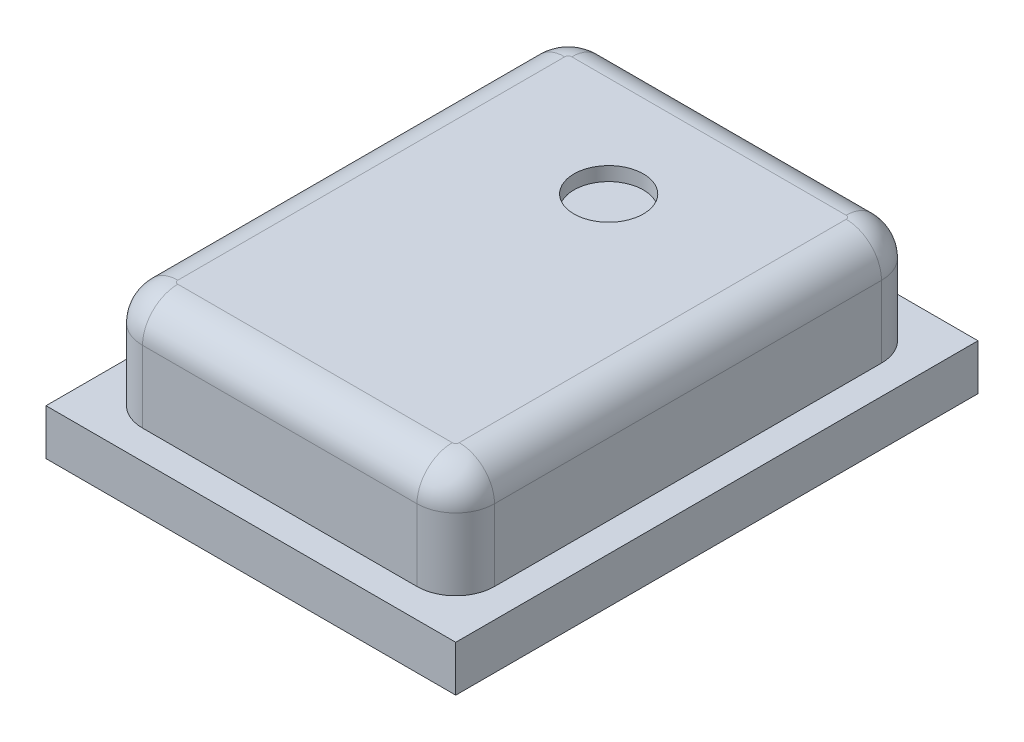
ISO-10303-21;
HEADER;
FILE_DESCRIPTION(('STEP AP214'),'2;1');
FILE_NAME('part.step','',(''),(''),'','','');
FILE_SCHEMA(('AUTOMOTIVE_DESIGN { 1 0 10303 214 1 1 1 1 }'));
ENDSEC;
DATA;
#1=APPLICATION_CONTEXT('core data for automotive mechanical design processes');
#2=APPLICATION_PROTOCOL_DEFINITION('international standard','automotive_design',2000,#1);
#3=PRODUCT_CONTEXT('',#1,'mechanical');
#4=PRODUCT('Part','Part','',(#3));
#5=PRODUCT_RELATED_PRODUCT_CATEGORY('part','',(#4));
#6=PRODUCT_DEFINITION_FORMATION('','',#4);
#7=PRODUCT_DEFINITION_CONTEXT('part definition',#1,'design');
#8=PRODUCT_DEFINITION('design','',#6,#7);
#9=PRODUCT_DEFINITION_SHAPE('','',#8);
#10=(LENGTH_UNIT() NAMED_UNIT(*) SI_UNIT(.MILLI.,.METRE.));
#11=(NAMED_UNIT(*) PLANE_ANGLE_UNIT() SI_UNIT($,.RADIAN.));
#12=(NAMED_UNIT(*) SI_UNIT($,.STERADIAN.) SOLID_ANGLE_UNIT());
#13=UNCERTAINTY_MEASURE_WITH_UNIT(LENGTH_MEASURE(1.E-05),#10,'distance_accuracy_value','');
#14=(GEOMETRIC_REPRESENTATION_CONTEXT(3) GLOBAL_UNCERTAINTY_ASSIGNED_CONTEXT((#13)) GLOBAL_UNIT_ASSIGNED_CONTEXT((#10,
#11,#12)) REPRESENTATION_CONTEXT('',''));
#15=CARTESIAN_POINT('',(0.,0.,0.));
#16=DIRECTION('',(0.,0.,1.));
#17=DIRECTION('',(1.,0.,0.));
#18=AXIS2_PLACEMENT_3D('',#15,#16,#17);
#19=CARTESIAN_POINT('',(0.,1.1,0.));
#20=DIRECTION('',(0.,-1.,0.));
#21=DIRECTION('',(0.,0.,-1.));
#22=AXIS2_PLACEMENT_3D('',#19,#20,#21);
#23=PLANE('',#22);
#24=CARTESIAN_POINT('',(0.,1.1,-0.696));
#25=DIRECTION('',(0.,1.,0.));
#26=DIRECTION('',(0.,0.,1.));
#27=AXIS2_PLACEMENT_3D('',#24,#25,#26);
#28=CIRCLE('',#27,0.25);
#29=CARTESIAN_POINT('',(0.,1.1,-0.446));
#30=VERTEX_POINT('',#29);
#31=EDGE_CURVE('E316',#30,#30,#28,.T.);
#32=ORIENTED_EDGE('',*,*,#31,.F.);
#33=EDGE_LOOP('',(#32));
#34=FACE_BOUND('',#33,.T.);
#35=CARTESIAN_POINT('',(-0.988,1.1,1.393));
#36=DIRECTION('',(0.,-1.,0.));
#37=DIRECTION('',(0.,0.,-1.));
#38=AXIS2_PLACEMENT_3D('',#35,#36,#37);
#39=CIRCLE('',#38,0.025);
#40=CARTESIAN_POINT('',(-0.988,1.1,1.418));
#41=VERTEX_POINT('',#40);
#42=CARTESIAN_POINT('',(-1.013,1.1,1.393));
#43=VERTEX_POINT('',#42);
#44=EDGE_CURVE('E240',#41,#43,#39,.T.);
#45=ORIENTED_EDGE('',*,*,#44,.F.);
#46=DIRECTION('',(1.,0.,0.));
#47=VECTOR('',#46,1.);
#48=CARTESIAN_POINT('',(0.,1.1,1.418));
#49=LINE('',#48,#47);
#50=CARTESIAN_POINT('',(0.988,1.1,1.418));
#51=VERTEX_POINT('',#50);
#52=EDGE_CURVE('E203',#41,#51,#49,.T.);
#53=ORIENTED_EDGE('',*,*,#52,.T.);
#54=CARTESIAN_POINT('',(0.988,1.1,1.393));
#55=DIRECTION('',(0.,-1.,0.));
#56=DIRECTION('',(0.,0.,-1.));
#57=AXIS2_PLACEMENT_3D('',#54,#55,#56);
#58=CIRCLE('',#57,0.025);
#59=CARTESIAN_POINT('',(1.013,1.1,1.393));
#60=VERTEX_POINT('',#59);
#61=EDGE_CURVE('E236',#60,#51,#58,.T.);
#62=ORIENTED_EDGE('',*,*,#61,.F.);
#63=DIRECTION('',(0.,0.,-1.));
#64=VECTOR('',#63,1.);
#65=CARTESIAN_POINT('',(1.013,1.1,0.));
#66=LINE('',#65,#64);
#67=CARTESIAN_POINT('',(1.013,1.1,-1.393));
#68=VERTEX_POINT('',#67);
#69=EDGE_CURVE('E185',#60,#68,#66,.T.);
#70=ORIENTED_EDGE('',*,*,#69,.T.);
#71=CARTESIAN_POINT('',(0.988,1.1,-1.393));
#72=DIRECTION('',(0.,-1.,0.));
#73=DIRECTION('',(0.,0.,-1.));
#74=AXIS2_PLACEMENT_3D('',#71,#72,#73);
#75=CIRCLE('',#74,0.025);
#76=CARTESIAN_POINT('',(0.988,1.1,-1.418));
#77=VERTEX_POINT('',#76);
#78=EDGE_CURVE('E229',#77,#68,#75,.T.);
#79=ORIENTED_EDGE('',*,*,#78,.F.);
#80=DIRECTION('',(-1.,0.,0.));
#81=VECTOR('',#80,1.);
#82=CARTESIAN_POINT('',(0.,1.1,-1.418));
#83=LINE('',#82,#81);
#84=CARTESIAN_POINT('',(-0.988,1.1,-1.418));
#85=VERTEX_POINT('',#84);
#86=EDGE_CURVE('E190',#77,#85,#83,.T.);
#87=ORIENTED_EDGE('',*,*,#86,.T.);
#88=CARTESIAN_POINT('',(-0.988,1.1,-1.393));
#89=DIRECTION('',(0.,-1.,0.));
#90=DIRECTION('',(0.,0.,-1.));
#91=AXIS2_PLACEMENT_3D('',#88,#89,#90);
#92=CIRCLE('',#91,0.025);
#93=CARTESIAN_POINT('',(-1.013,1.1,-1.393));
#94=VERTEX_POINT('',#93);
#95=EDGE_CURVE('E233',#94,#85,#92,.T.);
#96=ORIENTED_EDGE('',*,*,#95,.F.);
#97=DIRECTION('',(0.,0.,1.));
#98=VECTOR('',#97,1.);
#99=CARTESIAN_POINT('',(-1.013,1.1,0.));
#100=LINE('',#99,#98);
#101=EDGE_CURVE('E199',#94,#43,#100,.T.);
#102=ORIENTED_EDGE('',*,*,#101,.T.);
#103=EDGE_LOOP('',(#45,#53,#62,#70,#79,#87,#96,#102));
#104=FACE_BOUND('',#103,.T.);
#105=ADVANCED_FACE('F41',(#34,#104),#23,.F.);
#106=CARTESIAN_POINT('',(1.475,0.33,-1.88));
#107=DIRECTION('',(-1.,0.,0.));
#108=DIRECTION('',(0.,0.,1.));
#109=AXIS2_PLACEMENT_3D('',#106,#107,#108);
#110=PLANE('',#109);
#111=DIRECTION('',(0.,0.,-1.));
#112=VECTOR('',#111,1.);
#113=CARTESIAN_POINT('',(1.475,0.,-1.88));
#114=LINE('',#113,#112);
#115=CARTESIAN_POINT('',(1.475,0.,1.88));
#116=VERTEX_POINT('',#115);
#117=CARTESIAN_POINT('',(1.475,0.,-1.88));
#118=VERTEX_POINT('',#117);
#119=EDGE_CURVE('E183',#116,#118,#114,.T.);
#120=ORIENTED_EDGE('',*,*,#119,.T.);
#121=DIRECTION('',(0.,-1.,0.));
#122=VECTOR('',#121,1.);
#123=CARTESIAN_POINT('',(1.475,0.33,-1.88));
#124=LINE('',#123,#122);
#125=CARTESIAN_POINT('',(1.475,0.33,-1.88));
#126=VERTEX_POINT('',#125);
#127=EDGE_CURVE('E161',#126,#118,#124,.T.);
#128=ORIENTED_EDGE('',*,*,#127,.F.);
#129=DIRECTION('',(0.,0.,-1.));
#130=VECTOR('',#129,1.);
#131=CARTESIAN_POINT('',(1.475,0.33,-1.88));
#132=LINE('',#131,#130);
#133=CARTESIAN_POINT('',(1.475,0.33,1.88));
#134=VERTEX_POINT('',#133);
#135=EDGE_CURVE('E169',#134,#126,#132,.T.);
#136=ORIENTED_EDGE('',*,*,#135,.F.);
#137=DIRECTION('',(0.,-1.,0.));
#138=VECTOR('',#137,1.);
#139=CARTESIAN_POINT('',(1.475,0.33,1.88));
#140=LINE('',#139,#138);
#141=EDGE_CURVE('E342',#134,#116,#140,.T.);
#142=ORIENTED_EDGE('',*,*,#141,.T.);
#143=EDGE_LOOP('',(#120,#128,#136,#142));
#144=FACE_BOUND('',#143,.T.);
#145=ADVANCED_FACE('F181',(#144),#110,.F.);
#146=CARTESIAN_POINT('',(-1.475,0.33,-1.88));
#147=DIRECTION('',(0.,0.,1.));
#148=DIRECTION('',(1.,0.,0.));
#149=AXIS2_PLACEMENT_3D('',#146,#147,#148);
#150=PLANE('',#149);
#151=DIRECTION('',(-1.,0.,0.));
#152=VECTOR('',#151,1.);
#153=CARTESIAN_POINT('',(-1.475,0.,-1.88));
#154=LINE('',#153,#152);
#155=CARTESIAN_POINT('',(-1.475,0.,-1.88));
#156=VERTEX_POINT('',#155);
#157=EDGE_CURVE('E345',#118,#156,#154,.T.);
#158=ORIENTED_EDGE('',*,*,#157,.T.);
#159=DIRECTION('',(0.,-1.,0.));
#160=VECTOR('',#159,1.);
#161=CARTESIAN_POINT('',(-1.475,0.33,-1.88));
#162=LINE('',#161,#160);
#163=CARTESIAN_POINT('',(-1.475,0.33,-1.88));
#164=VERTEX_POINT('',#163);
#165=EDGE_CURVE('E164',#164,#156,#162,.T.);
#166=ORIENTED_EDGE('',*,*,#165,.F.);
#167=DIRECTION('',(-1.,0.,0.));
#168=VECTOR('',#167,1.);
#169=CARTESIAN_POINT('',(-1.475,0.33,-1.88));
#170=LINE('',#169,#168);
#171=EDGE_CURVE('E157',#126,#164,#170,.T.);
#172=ORIENTED_EDGE('',*,*,#171,.F.);
#173=ORIENTED_EDGE('',*,*,#127,.T.);
#174=EDGE_LOOP('',(#158,#166,#172,#173));
#175=FACE_BOUND('',#174,.T.);
#176=ADVANCED_FACE('F159',(#175),#150,.F.);
#177=CARTESIAN_POINT('',(-1.475,0.33,-1.88));
#178=DIRECTION('',(1.,0.,0.));
#179=DIRECTION('',(0.,0.,-1.));
#180=AXIS2_PLACEMENT_3D('',#177,#178,#179);
#181=PLANE('',#180);
#182=DIRECTION('',(0.,0.,1.));
#183=VECTOR('',#182,1.);
#184=CARTESIAN_POINT('',(-1.475,0.,-1.88));
#185=LINE('',#184,#183);
#186=CARTESIAN_POINT('',(-1.475,0.,1.88));
#187=VERTEX_POINT('',#186);
#188=EDGE_CURVE('E348',#156,#187,#185,.T.);
#189=ORIENTED_EDGE('',*,*,#188,.T.);
#190=DIRECTION('',(0.,-1.,0.));
#191=VECTOR('',#190,1.);
#192=CARTESIAN_POINT('',(-1.475,0.33,1.88));
#193=LINE('',#192,#191);
#194=CARTESIAN_POINT('',(-1.475,0.33,1.88));
#195=VERTEX_POINT('',#194);
#196=EDGE_CURVE('E192',#195,#187,#193,.T.);
#197=ORIENTED_EDGE('',*,*,#196,.F.);
#198=DIRECTION('',(0.,0.,1.));
#199=VECTOR('',#198,1.);
#200=CARTESIAN_POINT('',(-1.475,0.33,-1.88));
#201=LINE('',#200,#199);
#202=EDGE_CURVE('E168',#164,#195,#201,.T.);
#203=ORIENTED_EDGE('',*,*,#202,.F.);
#204=ORIENTED_EDGE('',*,*,#165,.T.);
#205=EDGE_LOOP('',(#189,#197,#203,#204));
#206=FACE_BOUND('',#205,.T.);
#207=ADVANCED_FACE('F364',(#206),#181,.F.);
#208=CARTESIAN_POINT('',(-1.475,0.33,1.88));
#209=DIRECTION('',(0.,0.,-1.));
#210=DIRECTION('',(-1.,0.,0.));
#211=AXIS2_PLACEMENT_3D('',#208,#209,#210);
#212=PLANE('',#211);
#213=DIRECTION('',(1.,0.,0.));
#214=VECTOR('',#213,1.);
#215=CARTESIAN_POINT('',(-1.475,0.,1.88));
#216=LINE('',#215,#214);
#217=EDGE_CURVE('E179',#187,#116,#216,.T.);
#218=ORIENTED_EDGE('',*,*,#217,.T.);
#219=ORIENTED_EDGE('',*,*,#141,.F.);
#220=DIRECTION('',(1.,0.,0.));
#221=VECTOR('',#220,1.);
#222=CARTESIAN_POINT('',(-1.475,0.33,1.88));
#223=LINE('',#222,#221);
#224=EDGE_CURVE('E174',#195,#134,#223,.T.);
#225=ORIENTED_EDGE('',*,*,#224,.F.);
#226=ORIENTED_EDGE('',*,*,#196,.T.);
#227=EDGE_LOOP('',(#218,#219,#225,#226));
#228=FACE_BOUND('',#227,.T.);
#229=ADVANCED_FACE('F359',(#228),#212,.F.);
#230=CARTESIAN_POINT('',(0.,0.33,0.));
#231=DIRECTION('',(0.,1.,0.));
#232=DIRECTION('',(0.,0.,1.));
#233=AXIS2_PLACEMENT_3D('',#230,#231,#232);
#234=PLANE('',#233);
#235=DIRECTION('',(0.,0.,-1.));
#236=VECTOR('',#235,1.);
#237=CARTESIAN_POINT('',(1.267,0.33,1.672));
#238=LINE('',#237,#236);
#239=CARTESIAN_POINT('',(1.267,0.33,1.393));
#240=VERTEX_POINT('',#239);
#241=CARTESIAN_POINT('',(1.267,0.33,-1.393));
#242=VERTEX_POINT('',#241);
#243=EDGE_CURVE('E297',#240,#242,#238,.T.);
#244=ORIENTED_EDGE('',*,*,#243,.F.);
#245=CARTESIAN_POINT('',(0.988,0.33,1.393));
#246=DIRECTION('',(0.,1.,0.));
#247=DIRECTION('',(0.,0.,1.));
#248=AXIS2_PLACEMENT_3D('',#245,#246,#247);
#249=CIRCLE('',#248,0.279);
#250=CARTESIAN_POINT('',(0.988,0.33,1.672));
#251=VERTEX_POINT('',#250);
#252=EDGE_CURVE('E51',#240,#251,#249,.F.);
#253=ORIENTED_EDGE('',*,*,#252,.T.);
#254=DIRECTION('',(1.,0.,0.));
#255=VECTOR('',#254,1.);
#256=CARTESIAN_POINT('',(-1.267,0.33,1.672));
#257=LINE('',#256,#255);
#258=CARTESIAN_POINT('',(-0.988,0.33,1.672));
#259=VERTEX_POINT('',#258);
#260=EDGE_CURVE('E335',#259,#251,#257,.T.);
#261=ORIENTED_EDGE('',*,*,#260,.F.);
#262=CARTESIAN_POINT('',(-0.988,0.33,1.393));
#263=DIRECTION('',(0.,1.,0.));
#264=DIRECTION('',(0.,0.,1.));
#265=AXIS2_PLACEMENT_3D('',#262,#263,#264);
#266=CIRCLE('',#265,0.279);
#267=CARTESIAN_POINT('',(-1.267,0.33,1.393));
#268=VERTEX_POINT('',#267);
#269=EDGE_CURVE('E11',#259,#268,#266,.F.);
#270=ORIENTED_EDGE('',*,*,#269,.T.);
#271=DIRECTION('',(0.,0.,1.));
#272=VECTOR('',#271,1.);
#273=CARTESIAN_POINT('',(-1.267,0.33,1.672));
#274=LINE('',#273,#272);
#275=CARTESIAN_POINT('',(-1.267,0.33,-1.393));
#276=VERTEX_POINT('',#275);
#277=EDGE_CURVE('E331',#276,#268,#274,.T.);
#278=ORIENTED_EDGE('',*,*,#277,.F.);
#279=CARTESIAN_POINT('',(-0.988,0.33,-1.393));
#280=DIRECTION('',(0.,1.,0.));
#281=DIRECTION('',(0.,0.,1.));
#282=AXIS2_PLACEMENT_3D('',#279,#280,#281);
#283=CIRCLE('',#282,0.279);
#284=CARTESIAN_POINT('',(-0.988,0.33,-1.672));
#285=VERTEX_POINT('',#284);
#286=EDGE_CURVE('E288',#276,#285,#283,.F.);
#287=ORIENTED_EDGE('',*,*,#286,.T.);
#288=DIRECTION('',(-1.,0.,0.));
#289=VECTOR('',#288,1.);
#290=CARTESIAN_POINT('',(-1.267,0.33,-1.672));
#291=LINE('',#290,#289);
#292=CARTESIAN_POINT('',(0.988,0.33,-1.672));
#293=VERTEX_POINT('',#292);
#294=EDGE_CURVE('E327',#293,#285,#291,.T.);
#295=ORIENTED_EDGE('',*,*,#294,.F.);
#296=CARTESIAN_POINT('',(0.988,0.33,-1.393));
#297=DIRECTION('',(0.,1.,0.));
#298=DIRECTION('',(0.,0.,1.));
#299=AXIS2_PLACEMENT_3D('',#296,#297,#298);
#300=CIRCLE('',#299,0.279);
#301=EDGE_CURVE('E285',#293,#242,#300,.F.);
#302=ORIENTED_EDGE('',*,*,#301,.T.);
#303=EDGE_LOOP('',(#244,#253,#261,#270,#278,#287,#295,#302));
#304=FACE_BOUND('',#303,.T.);
#305=ORIENTED_EDGE('',*,*,#135,.T.);
#306=ORIENTED_EDGE('',*,*,#171,.T.);
#307=ORIENTED_EDGE('',*,*,#202,.T.);
#308=ORIENTED_EDGE('',*,*,#224,.T.);
#309=EDGE_LOOP('',(#305,#306,#307,#308));
#310=FACE_BOUND('',#309,.T.);
#311=ADVANCED_FACE('F172',(#304,#310),#234,.T.);
#312=CARTESIAN_POINT('',(0.,0.,0.));
#313=DIRECTION('',(0.,1.,0.));
#314=DIRECTION('',(0.,0.,1.));
#315=AXIS2_PLACEMENT_3D('',#312,#313,#314);
#316=PLANE('',#315);
#317=ORIENTED_EDGE('',*,*,#119,.F.);
#318=ORIENTED_EDGE('',*,*,#217,.F.);
#319=ORIENTED_EDGE('',*,*,#188,.F.);
#320=ORIENTED_EDGE('',*,*,#157,.F.);
#321=EDGE_LOOP('',(#317,#318,#319,#320));
#322=FACE_BOUND('',#321,.T.);
#323=ADVANCED_FACE('F363',(#322),#316,.F.);
#324=CARTESIAN_POINT('',(1.267,1.1,1.672));
#325=DIRECTION('',(-1.,0.,0.));
#326=DIRECTION('',(0.,0.,1.));
#327=AXIS2_PLACEMENT_3D('',#324,#325,#326);
#328=PLANE('',#327);
#329=ORIENTED_EDGE('',*,*,#243,.T.);
#330=DIRECTION('',(0.,-1.,0.));
#331=VECTOR('',#330,1.);
#332=CARTESIAN_POINT('',(1.267,1.1,-1.393));
#333=LINE('',#332,#331);
#334=CARTESIAN_POINT('',(1.267,0.846,-1.393));
#335=VERTEX_POINT('',#334);
#336=EDGE_CURVE('E271',#242,#335,#333,.F.);
#337=ORIENTED_EDGE('',*,*,#336,.T.);
#338=DIRECTION('',(0.,0.,-1.));
#339=VECTOR('',#338,1.);
#340=CARTESIAN_POINT('',(1.267,0.846,1.672));
#341=LINE('',#340,#339);
#342=CARTESIAN_POINT('',(1.267,0.846,1.393));
#343=VERTEX_POINT('',#342);
#344=EDGE_CURVE('E218',#335,#343,#341,.F.);
#345=ORIENTED_EDGE('',*,*,#344,.T.);
#346=DIRECTION('',(0.,-1.,0.));
#347=VECTOR('',#346,1.);
#348=CARTESIAN_POINT('',(1.267,1.1,1.393));
#349=LINE('',#348,#347);
#350=EDGE_CURVE('E268',#343,#240,#349,.T.);
#351=ORIENTED_EDGE('',*,*,#350,.T.);
#352=EDGE_LOOP('',(#329,#337,#345,#351));
#353=FACE_BOUND('',#352,.T.);
#354=ADVANCED_FACE('F397',(#353),#328,.F.);
#355=CARTESIAN_POINT('',(-1.267,1.1,-1.672));
#356=DIRECTION('',(0.,0.,1.));
#357=DIRECTION('',(1.,0.,0.));
#358=AXIS2_PLACEMENT_3D('',#355,#356,#357);
#359=PLANE('',#358);
#360=DIRECTION('',(-1.,0.,0.));
#361=VECTOR('',#360,1.);
#362=CARTESIAN_POINT('',(-1.267,0.846,-1.672));
#363=LINE('',#362,#361);
#364=CARTESIAN_POINT('',(-0.988,0.846,-1.672));
#365=VERTEX_POINT('',#364);
#366=CARTESIAN_POINT('',(0.988,0.846,-1.672));
#367=VERTEX_POINT('',#366);
#368=EDGE_CURVE('E214',#365,#367,#363,.F.);
#369=ORIENTED_EDGE('',*,*,#368,.T.);
#370=DIRECTION('',(0.,-1.,0.));
#371=VECTOR('',#370,1.);
#372=CARTESIAN_POINT('',(0.988,1.1,-1.672));
#373=LINE('',#372,#371);
#374=EDGE_CURVE('E265',#367,#293,#373,.T.);
#375=ORIENTED_EDGE('',*,*,#374,.T.);
#376=ORIENTED_EDGE('',*,*,#294,.T.);
#377=DIRECTION('',(0.,-1.,0.));
#378=VECTOR('',#377,1.);
#379=CARTESIAN_POINT('',(-0.988,1.1,-1.672));
#380=LINE('',#379,#378);
#381=EDGE_CURVE('E262',#285,#365,#380,.F.);
#382=ORIENTED_EDGE('',*,*,#381,.T.);
#383=EDGE_LOOP('',(#369,#375,#376,#382));
#384=FACE_BOUND('',#383,.T.);
#385=ADVANCED_FACE('F393',(#384),#359,.F.);
#386=CARTESIAN_POINT('',(-1.267,1.1,1.672));
#387=DIRECTION('',(1.,0.,0.));
#388=DIRECTION('',(0.,0.,-1.));
#389=AXIS2_PLACEMENT_3D('',#386,#387,#388);
#390=PLANE('',#389);
#391=DIRECTION('',(0.,0.,1.));
#392=VECTOR('',#391,1.);
#393=CARTESIAN_POINT('',(-1.267,0.846,1.672));
#394=LINE('',#393,#392);
#395=CARTESIAN_POINT('',(-1.267,0.846,1.393));
#396=VERTEX_POINT('',#395);
#397=CARTESIAN_POINT('',(-1.267,0.846,-1.393));
#398=VERTEX_POINT('',#397);
#399=EDGE_CURVE('E210',#396,#398,#394,.F.);
#400=ORIENTED_EDGE('',*,*,#399,.T.);
#401=DIRECTION('',(0.,-1.,0.));
#402=VECTOR('',#401,1.);
#403=CARTESIAN_POINT('',(-1.267,1.1,-1.393));
#404=LINE('',#403,#402);
#405=EDGE_CURVE('E277',#398,#276,#404,.T.);
#406=ORIENTED_EDGE('',*,*,#405,.T.);
#407=ORIENTED_EDGE('',*,*,#277,.T.);
#408=DIRECTION('',(0.,-1.,0.));
#409=VECTOR('',#408,1.);
#410=CARTESIAN_POINT('',(-1.267,1.1,1.393));
#411=LINE('',#410,#409);
#412=EDGE_CURVE('E274',#268,#396,#411,.F.);
#413=ORIENTED_EDGE('',*,*,#412,.T.);
#414=EDGE_LOOP('',(#400,#406,#407,#413));
#415=FACE_BOUND('',#414,.T.);
#416=ADVANCED_FACE('F390',(#415),#390,.F.);
#417=CARTESIAN_POINT('',(-1.267,1.1,1.672));
#418=DIRECTION('',(0.,0.,-1.));
#419=DIRECTION('',(-1.,0.,0.));
#420=AXIS2_PLACEMENT_3D('',#417,#418,#419);
#421=PLANE('',#420);
#422=ORIENTED_EDGE('',*,*,#260,.T.);
#423=DIRECTION('',(0.,-1.,0.));
#424=VECTOR('',#423,1.);
#425=CARTESIAN_POINT('',(0.988,1.1,1.672));
#426=LINE('',#425,#424);
#427=CARTESIAN_POINT('',(0.988,0.846,1.672));
#428=VERTEX_POINT('',#427);
#429=EDGE_CURVE('E282',#251,#428,#426,.F.);
#430=ORIENTED_EDGE('',*,*,#429,.T.);
#431=DIRECTION('',(1.,0.,0.));
#432=VECTOR('',#431,1.);
#433=CARTESIAN_POINT('',(-1.267,0.846,1.672));
#434=LINE('',#433,#432);
#435=CARTESIAN_POINT('',(-0.988,0.846,1.672));
#436=VERTEX_POINT('',#435);
#437=EDGE_CURVE('E207',#428,#436,#434,.F.);
#438=ORIENTED_EDGE('',*,*,#437,.T.);
#439=DIRECTION('',(0.,-1.,0.));
#440=VECTOR('',#439,1.);
#441=CARTESIAN_POINT('',(-0.988,1.1,1.672));
#442=LINE('',#441,#440);
#443=EDGE_CURVE('E65',#436,#259,#442,.T.);
#444=ORIENTED_EDGE('',*,*,#443,.T.);
#445=EDGE_LOOP('',(#422,#430,#438,#444));
#446=FACE_BOUND('',#445,.T.);
#447=ADVANCED_FACE('F386',(#446),#421,.F.);
#448=CARTESIAN_POINT('',(0.,0.846,-1.418));
#449=DIRECTION('',(-1.,0.,0.));
#450=DIRECTION('',(0.,0.,1.));
#451=AXIS2_PLACEMENT_3D('',#448,#449,#450);
#452=CYLINDRICAL_SURFACE('',#451,0.254);
#453=ORIENTED_EDGE('',*,*,#368,.F.);
#454=CARTESIAN_POINT('',(-0.988,0.846,-1.418));
#455=DIRECTION('',(1.,0.,0.));
#456=DIRECTION('',(0.,0.,-1.));
#457=AXIS2_PLACEMENT_3D('',#454,#455,#456);
#458=CIRCLE('',#457,0.254);
#459=EDGE_CURVE('E252',#365,#85,#458,.T.);
#460=ORIENTED_EDGE('',*,*,#459,.T.);
#461=ORIENTED_EDGE('',*,*,#86,.F.);
#462=CARTESIAN_POINT('',(0.988,0.846,-1.418));
#463=DIRECTION('',(-1.,0.,0.));
#464=DIRECTION('',(0.,0.,1.));
#465=AXIS2_PLACEMENT_3D('',#462,#463,#464);
#466=CIRCLE('',#465,0.254);
#467=EDGE_CURVE('E249',#77,#367,#466,.T.);
#468=ORIENTED_EDGE('',*,*,#467,.T.);
#469=EDGE_LOOP('',(#453,#460,#461,#468));
#470=FACE_BOUND('',#469,.T.);
#471=ADVANCED_FACE('F389',(#470),#452,.T.);
#472=CARTESIAN_POINT('',(-1.013,0.846,0.));
#473=DIRECTION('',(0.,0.,1.));
#474=DIRECTION('',(1.,0.,0.));
#475=AXIS2_PLACEMENT_3D('',#472,#473,#474);
#476=CYLINDRICAL_SURFACE('',#475,0.254);
#477=ORIENTED_EDGE('',*,*,#399,.F.);
#478=CARTESIAN_POINT('',(-1.013,0.846,1.393));
#479=DIRECTION('',(0.,0.,-1.));
#480=DIRECTION('',(-1.,0.,0.));
#481=AXIS2_PLACEMENT_3D('',#478,#479,#480);
#482=CIRCLE('',#481,0.254);
#483=EDGE_CURVE('E225',#396,#43,#482,.T.);
#484=ORIENTED_EDGE('',*,*,#483,.T.);
#485=ORIENTED_EDGE('',*,*,#101,.F.);
#486=CARTESIAN_POINT('',(-1.013,0.846,-1.393));
#487=DIRECTION('',(0.,0.,1.));
#488=DIRECTION('',(1.,0.,0.));
#489=AXIS2_PLACEMENT_3D('',#486,#487,#488);
#490=CIRCLE('',#489,0.254);
#491=EDGE_CURVE('E222',#94,#398,#490,.T.);
#492=ORIENTED_EDGE('',*,*,#491,.T.);
#493=EDGE_LOOP('',(#477,#484,#485,#492));
#494=FACE_BOUND('',#493,.T.);
#495=ADVANCED_FACE('F432',(#494),#476,.T.);
#496=CARTESIAN_POINT('',(1.013,0.846,0.));
#497=DIRECTION('',(0.,0.,-1.));
#498=DIRECTION('',(-1.,0.,0.));
#499=AXIS2_PLACEMENT_3D('',#496,#497,#498);
#500=CYLINDRICAL_SURFACE('',#499,0.254);
#501=ORIENTED_EDGE('',*,*,#344,.F.);
#502=CARTESIAN_POINT('',(1.013,0.846,-1.393));
#503=DIRECTION('',(0.,0.,1.));
#504=DIRECTION('',(1.,0.,0.));
#505=AXIS2_PLACEMENT_3D('',#502,#503,#504);
#506=CIRCLE('',#505,0.254);
#507=EDGE_CURVE('E259',#335,#68,#506,.T.);
#508=ORIENTED_EDGE('',*,*,#507,.T.);
#509=ORIENTED_EDGE('',*,*,#69,.F.);
#510=CARTESIAN_POINT('',(1.013,0.846,1.393));
#511=DIRECTION('',(0.,0.,-1.));
#512=DIRECTION('',(-1.,0.,0.));
#513=AXIS2_PLACEMENT_3D('',#510,#511,#512);
#514=CIRCLE('',#513,0.254);
#515=EDGE_CURVE('E256',#60,#343,#514,.T.);
#516=ORIENTED_EDGE('',*,*,#515,.T.);
#517=EDGE_LOOP('',(#501,#508,#509,#516));
#518=FACE_BOUND('',#517,.T.);
#519=ADVANCED_FACE('F440',(#518),#500,.T.);
#520=CARTESIAN_POINT('',(0.,0.846,1.418));
#521=DIRECTION('',(1.,0.,0.));
#522=DIRECTION('',(0.,0.,-1.));
#523=AXIS2_PLACEMENT_3D('',#520,#521,#522);
#524=CYLINDRICAL_SURFACE('',#523,0.254);
#525=ORIENTED_EDGE('',*,*,#437,.F.);
#526=CARTESIAN_POINT('',(0.988,0.846,1.418));
#527=DIRECTION('',(-1.,0.,0.));
#528=DIRECTION('',(0.,0.,1.));
#529=AXIS2_PLACEMENT_3D('',#526,#527,#528);
#530=CIRCLE('',#529,0.254);
#531=EDGE_CURVE('E246',#428,#51,#530,.T.);
#532=ORIENTED_EDGE('',*,*,#531,.T.);
#533=ORIENTED_EDGE('',*,*,#52,.F.);
#534=CARTESIAN_POINT('',(-0.988,0.846,1.418));
#535=DIRECTION('',(1.,0.,0.));
#536=DIRECTION('',(0.,0.,-1.));
#537=AXIS2_PLACEMENT_3D('',#534,#535,#536);
#538=CIRCLE('',#537,0.254);
#539=EDGE_CURVE('E243',#41,#436,#538,.T.);
#540=ORIENTED_EDGE('',*,*,#539,.T.);
#541=EDGE_LOOP('',(#525,#532,#533,#540));
#542=FACE_BOUND('',#541,.T.);
#543=ADVANCED_FACE('F448',(#542),#524,.T.);
#544=CARTESIAN_POINT('',(-0.988,1.1,1.393));
#545=DIRECTION('',(0.,-1.,0.));
#546=DIRECTION('',(0.,0.,-1.));
#547=AXIS2_PLACEMENT_3D('',#544,#545,#546);
#548=CYLINDRICAL_SURFACE('',#547,0.279);
#549=ORIENTED_EDGE('',*,*,#269,.F.);
#550=ORIENTED_EDGE('',*,*,#443,.F.);
#551=CARTESIAN_POINT('',(-0.988,0.846,1.393));
#552=DIRECTION('',(0.,-1.,0.));
#553=DIRECTION('',(0.,0.,-1.));
#554=AXIS2_PLACEMENT_3D('',#551,#552,#553);
#555=CIRCLE('',#554,0.279);
#556=EDGE_CURVE('E293',#396,#436,#555,.F.);
#557=ORIENTED_EDGE('',*,*,#556,.F.);
#558=ORIENTED_EDGE('',*,*,#412,.F.);
#559=EDGE_LOOP('',(#549,#550,#557,#558));
#560=FACE_BOUND('',#559,.T.);
#561=ADVANCED_FACE('F456',(#560),#548,.T.);
#562=CARTESIAN_POINT('',(-0.988,0.846,1.393));
#563=DIRECTION('',(0.,-1.,0.));
#564=DIRECTION('',(0.,0.,-1.));
#565=AXIS2_PLACEMENT_3D('',#562,#563,#564);
#566=DEGENERATE_TOROIDAL_SURFACE('',#565,0.025,0.254,.T.);
#567=ORIENTED_EDGE('',*,*,#483,.F.);
#568=ORIENTED_EDGE('',*,*,#556,.T.);
#569=ORIENTED_EDGE('',*,*,#539,.F.);
#570=ORIENTED_EDGE('',*,*,#44,.T.);
#571=EDGE_LOOP('',(#567,#568,#569,#570));
#572=FACE_BOUND('',#571,.T.);
#573=ADVANCED_FACE('F464',(#572),#566,.T.);
#574=CARTESIAN_POINT('',(0.988,1.1,1.393));
#575=DIRECTION('',(0.,-1.,0.));
#576=DIRECTION('',(0.,0.,-1.));
#577=AXIS2_PLACEMENT_3D('',#574,#575,#576);
#578=CYLINDRICAL_SURFACE('',#577,0.279);
#579=ORIENTED_EDGE('',*,*,#252,.F.);
#580=ORIENTED_EDGE('',*,*,#350,.F.);
#581=CARTESIAN_POINT('',(0.988,0.846,1.393));
#582=DIRECTION('',(0.,-1.,0.));
#583=DIRECTION('',(0.,0.,-1.));
#584=AXIS2_PLACEMENT_3D('',#581,#582,#583);
#585=CIRCLE('',#584,0.279);
#586=EDGE_CURVE('E298',#428,#343,#585,.F.);
#587=ORIENTED_EDGE('',*,*,#586,.F.);
#588=ORIENTED_EDGE('',*,*,#429,.F.);
#589=EDGE_LOOP('',(#579,#580,#587,#588));
#590=FACE_BOUND('',#589,.T.);
#591=ADVANCED_FACE('F472',(#590),#578,.T.);
#592=CARTESIAN_POINT('',(0.988,0.846,1.393));
#593=DIRECTION('',(0.,-1.,0.));
#594=DIRECTION('',(0.,0.,-1.));
#595=AXIS2_PLACEMENT_3D('',#592,#593,#594);
#596=DEGENERATE_TOROIDAL_SURFACE('',#595,0.025,0.254,.T.);
#597=ORIENTED_EDGE('',*,*,#515,.F.);
#598=ORIENTED_EDGE('',*,*,#61,.T.);
#599=ORIENTED_EDGE('',*,*,#531,.F.);
#600=ORIENTED_EDGE('',*,*,#586,.T.);
#601=EDGE_LOOP('',(#597,#598,#599,#600));
#602=FACE_BOUND('',#601,.T.);
#603=ADVANCED_FACE('F480',(#602),#596,.T.);
#604=CARTESIAN_POINT('',(-0.988,1.1,-1.393));
#605=DIRECTION('',(0.,-1.,0.));
#606=DIRECTION('',(0.,0.,-1.));
#607=AXIS2_PLACEMENT_3D('',#604,#605,#606);
#608=CYLINDRICAL_SURFACE('',#607,0.279);
#609=ORIENTED_EDGE('',*,*,#286,.F.);
#610=ORIENTED_EDGE('',*,*,#405,.F.);
#611=CARTESIAN_POINT('',(-0.988,0.846,-1.393));
#612=DIRECTION('',(0.,-1.,0.));
#613=DIRECTION('',(0.,0.,-1.));
#614=AXIS2_PLACEMENT_3D('',#611,#612,#613);
#615=CIRCLE('',#614,0.279);
#616=EDGE_CURVE('E301',#365,#398,#615,.F.);
#617=ORIENTED_EDGE('',*,*,#616,.F.);
#618=ORIENTED_EDGE('',*,*,#381,.F.);
#619=EDGE_LOOP('',(#609,#610,#617,#618));
#620=FACE_BOUND('',#619,.T.);
#621=ADVANCED_FACE('F488',(#620),#608,.T.);
#622=CARTESIAN_POINT('',(-0.988,0.846,-1.393));
#623=DIRECTION('',(0.,-1.,0.));
#624=DIRECTION('',(0.,0.,-1.));
#625=AXIS2_PLACEMENT_3D('',#622,#623,#624);
#626=DEGENERATE_TOROIDAL_SURFACE('',#625,0.025,0.254,.T.);
#627=ORIENTED_EDGE('',*,*,#459,.F.);
#628=ORIENTED_EDGE('',*,*,#616,.T.);
#629=ORIENTED_EDGE('',*,*,#491,.F.);
#630=ORIENTED_EDGE('',*,*,#95,.T.);
#631=EDGE_LOOP('',(#627,#628,#629,#630));
#632=FACE_BOUND('',#631,.T.);
#633=ADVANCED_FACE('F496',(#632),#626,.T.);
#634=CARTESIAN_POINT('',(0.988,1.1,-1.393));
#635=DIRECTION('',(0.,-1.,0.));
#636=DIRECTION('',(0.,0.,-1.));
#637=AXIS2_PLACEMENT_3D('',#634,#635,#636);
#638=CYLINDRICAL_SURFACE('',#637,0.279);
#639=ORIENTED_EDGE('',*,*,#301,.F.);
#640=ORIENTED_EDGE('',*,*,#374,.F.);
#641=CARTESIAN_POINT('',(0.988,0.846,-1.393));
#642=DIRECTION('',(0.,-1.,0.));
#643=DIRECTION('',(0.,0.,-1.));
#644=AXIS2_PLACEMENT_3D('',#641,#642,#643);
#645=CIRCLE('',#644,0.279);
#646=EDGE_CURVE('E45',#335,#367,#645,.F.);
#647=ORIENTED_EDGE('',*,*,#646,.F.);
#648=ORIENTED_EDGE('',*,*,#336,.F.);
#649=EDGE_LOOP('',(#639,#640,#647,#648));
#650=FACE_BOUND('',#649,.T.);
#651=ADVANCED_FACE('F43',(#650),#638,.T.);
#652=CARTESIAN_POINT('',(0.988,0.846,-1.393));
#653=DIRECTION('',(0.,-1.,0.));
#654=DIRECTION('',(0.,0.,-1.));
#655=AXIS2_PLACEMENT_3D('',#652,#653,#654);
#656=DEGENERATE_TOROIDAL_SURFACE('',#655,0.025,0.254,.T.);
#657=ORIENTED_EDGE('',*,*,#467,.F.);
#658=ORIENTED_EDGE('',*,*,#78,.T.);
#659=ORIENTED_EDGE('',*,*,#507,.F.);
#660=ORIENTED_EDGE('',*,*,#646,.T.);
#661=EDGE_LOOP('',(#657,#658,#659,#660));
#662=FACE_BOUND('',#661,.T.);
#663=ADVANCED_FACE('F510',(#662),#656,.T.);
#664=CARTESIAN_POINT('',(0.,1.,-0.696));
#665=DIRECTION('',(0.,1.,0.));
#666=DIRECTION('',(0.,0.,1.));
#667=AXIS2_PLACEMENT_3D('',#664,#665,#666);
#668=CYLINDRICAL_SURFACE('',#667,0.25);
#669=CARTESIAN_POINT('',(0.,1.,-0.696));
#670=DIRECTION('',(0.,1.,0.));
#671=DIRECTION('',(0.,0.,1.));
#672=AXIS2_PLACEMENT_3D('',#669,#670,#671);
#673=CIRCLE('',#672,0.25);
#674=CARTESIAN_POINT('',(0.,1.,-0.446));
#675=VERTEX_POINT('',#674);
#676=EDGE_CURVE('E310',#675,#675,#673,.T.);
#677=ORIENTED_EDGE('',*,*,#676,.F.);
#678=EDGE_LOOP('',(#677));
#679=FACE_BOUND('',#678,.T.);
#680=ORIENTED_EDGE('',*,*,#31,.T.);
#681=EDGE_LOOP('',(#680));
#682=FACE_BOUND('',#681,.T.);
#683=ADVANCED_FACE('F384',(#679,#682),#668,.F.);
#684=CARTESIAN_POINT('',(0.,1.,-0.696));
#685=DIRECTION('',(0.,1.,0.));
#686=DIRECTION('',(0.,0.,1.));
#687=AXIS2_PLACEMENT_3D('',#684,#685,#686);
#688=PLANE('',#687);
#689=ORIENTED_EDGE('',*,*,#676,.T.);
#690=EDGE_LOOP('',(#689));
#691=FACE_BOUND('',#690,.T.);
#692=ADVANCED_FACE('F522',(#691),#688,.T.);
#693=CLOSED_SHELL('',(#105,#145,#176,#207,#229,#311,#323,#354,#385,#416,#447,#471,#495,#519,
#543,#561,#573,#591,#603,#621,#633,#651,#663,#683,#692));
#694=MANIFOLD_SOLID_BREP('B2',#693);
#695=ADVANCED_BREP_SHAPE_REPRESENTATION('',(#18,#694),#14);
#696=SHAPE_DEFINITION_REPRESENTATION(#9,#695);
ENDSEC;
END-ISO-10303-21;
